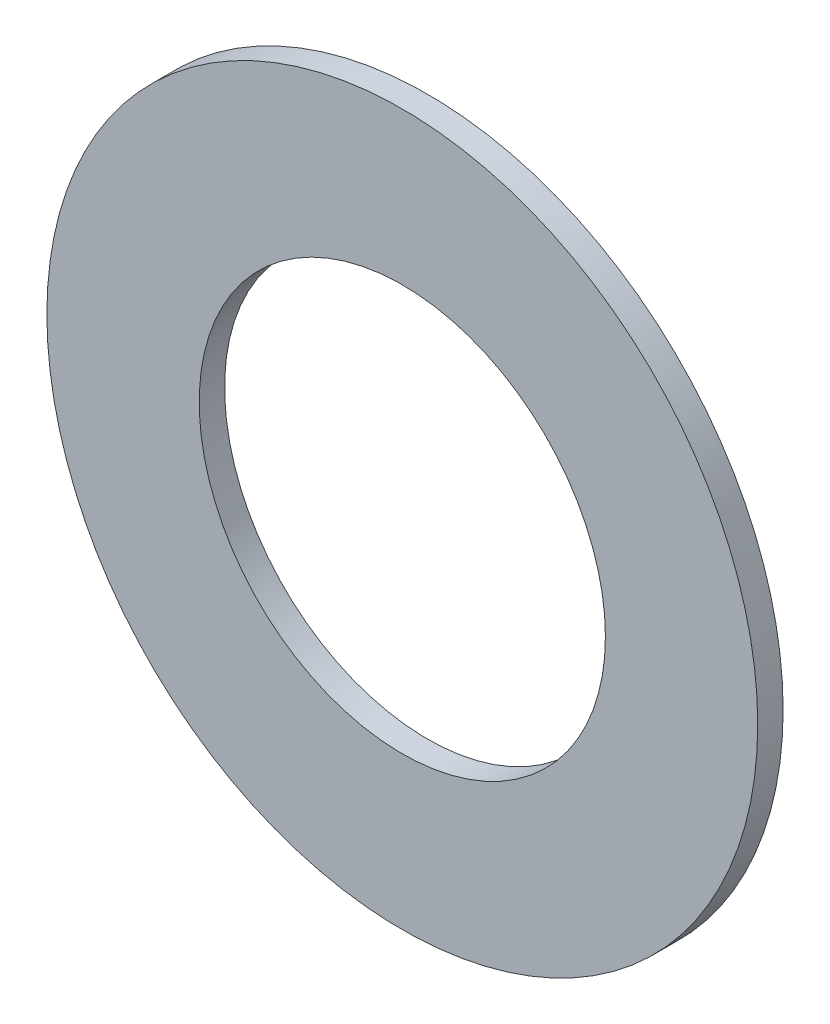
ISO-10303-21;
HEADER;
FILE_DESCRIPTION(('STEP AP214'),'2;1');
FILE_NAME('part.step','',(''),(''),'','','');
FILE_SCHEMA(('AUTOMOTIVE_DESIGN { 1 0 10303 214 1 1 1 1 }'));
ENDSEC;
DATA;
#1=APPLICATION_CONTEXT('core data for automotive mechanical design processes');
#2=APPLICATION_PROTOCOL_DEFINITION('international standard','automotive_design',2000,#1);
#3=PRODUCT_CONTEXT('',#1,'mechanical');
#4=PRODUCT('Part','Part','',(#3));
#5=PRODUCT_RELATED_PRODUCT_CATEGORY('part','',(#4));
#6=PRODUCT_DEFINITION_FORMATION('','',#4);
#7=PRODUCT_DEFINITION_CONTEXT('part definition',#1,'design');
#8=PRODUCT_DEFINITION('design','',#6,#7);
#9=PRODUCT_DEFINITION_SHAPE('','',#8);
#10=(LENGTH_UNIT() NAMED_UNIT(*) SI_UNIT(.MILLI.,.METRE.));
#11=(NAMED_UNIT(*) PLANE_ANGLE_UNIT() SI_UNIT($,.RADIAN.));
#12=(NAMED_UNIT(*) SI_UNIT($,.STERADIAN.) SOLID_ANGLE_UNIT());
#13=UNCERTAINTY_MEASURE_WITH_UNIT(LENGTH_MEASURE(1.E-05),#10,'distance_accuracy_value','');
#14=(GEOMETRIC_REPRESENTATION_CONTEXT(3) GLOBAL_UNCERTAINTY_ASSIGNED_CONTEXT((#13)) GLOBAL_UNIT_ASSIGNED_CONTEXT((#10,
#11,#12)) REPRESENTATION_CONTEXT('',''));
#15=CARTESIAN_POINT('',(0.,0.,0.));
#16=DIRECTION('',(0.,0.,1.));
#17=DIRECTION('',(1.,0.,0.));
#18=AXIS2_PLACEMENT_3D('',#15,#16,#17);
#19=CARTESIAN_POINT('',(0.,0.,1.));
#20=DIRECTION('',(0.,0.,-1.));
#21=DIRECTION('',(-1.,0.,0.));
#22=AXIS2_PLACEMENT_3D('',#19,#20,#21);
#23=CYLINDRICAL_SURFACE('',#22,14.);
#24=CARTESIAN_POINT('',(0.,0.,1.));
#25=DIRECTION('',(0.,0.,1.));
#26=DIRECTION('',(1.,0.,0.));
#27=AXIS2_PLACEMENT_3D('',#24,#25,#26);
#28=CIRCLE('',#27,14.);
#29=CARTESIAN_POINT('',(14.,0.,1.));
#30=VERTEX_POINT('',#29);
#31=EDGE_CURVE('E10',#30,#30,#28,.T.);
#32=ORIENTED_EDGE('',*,*,#31,.F.);
#33=EDGE_LOOP('',(#32));
#34=FACE_BOUND('',#33,.T.);
#35=CARTESIAN_POINT('',(0.,0.,0.));
#36=DIRECTION('',(0.,0.,1.));
#37=DIRECTION('',(1.,0.,0.));
#38=AXIS2_PLACEMENT_3D('',#35,#36,#37);
#39=CIRCLE('',#38,14.);
#40=CARTESIAN_POINT('',(14.,0.,0.));
#41=VERTEX_POINT('',#40);
#42=EDGE_CURVE('E40',#41,#41,#39,.T.);
#43=ORIENTED_EDGE('',*,*,#42,.T.);
#44=EDGE_LOOP('',(#43));
#45=FACE_BOUND('',#44,.T.);
#46=ADVANCED_FACE('F37',(#34,#45),#23,.T.);
#47=CARTESIAN_POINT('',(0.,0.,1.));
#48=DIRECTION('',(0.,0.,1.));
#49=DIRECTION('',(1.,0.,0.));
#50=AXIS2_PLACEMENT_3D('',#47,#48,#49);
#51=PLANE('',#50);
#52=CARTESIAN_POINT('',(0.,0.,1.));
#53=DIRECTION('',(0.,0.,1.));
#54=DIRECTION('',(1.,0.,0.));
#55=AXIS2_PLACEMENT_3D('',#52,#53,#54);
#56=CIRCLE('',#55,8.);
#57=CARTESIAN_POINT('',(8.,0.,1.));
#58=VERTEX_POINT('',#57);
#59=EDGE_CURVE('E51',#58,#58,#56,.T.);
#60=ORIENTED_EDGE('',*,*,#59,.F.);
#61=EDGE_LOOP('',(#60));
#62=FACE_BOUND('',#61,.T.);
#63=ORIENTED_EDGE('',*,*,#31,.T.);
#64=EDGE_LOOP('',(#63));
#65=FACE_BOUND('',#64,.T.);
#66=ADVANCED_FACE('F68',(#62,#65),#51,.T.);
#67=CARTESIAN_POINT('',(0.,0.,0.));
#68=DIRECTION('',(0.,0.,1.));
#69=DIRECTION('',(1.,0.,0.));
#70=AXIS2_PLACEMENT_3D('',#67,#68,#69);
#71=PLANE('',#70);
#72=CARTESIAN_POINT('',(0.,0.,0.));
#73=DIRECTION('',(0.,0.,1.));
#74=DIRECTION('',(1.,0.,0.));
#75=AXIS2_PLACEMENT_3D('',#72,#73,#74);
#76=CIRCLE('',#75,8.);
#77=CARTESIAN_POINT('',(8.,0.,0.));
#78=VERTEX_POINT('',#77);
#79=EDGE_CURVE('E49',#78,#78,#76,.T.);
#80=ORIENTED_EDGE('',*,*,#79,.T.);
#81=EDGE_LOOP('',(#80));
#82=FACE_BOUND('',#81,.T.);
#83=ORIENTED_EDGE('',*,*,#42,.F.);
#84=EDGE_LOOP('',(#83));
#85=FACE_BOUND('',#84,.T.);
#86=ADVANCED_FACE('F59',(#82,#85),#71,.F.);
#87=CARTESIAN_POINT('',(0.,0.,0.));
#88=DIRECTION('',(0.,0.,1.));
#89=DIRECTION('',(1.,0.,0.));
#90=AXIS2_PLACEMENT_3D('',#87,#88,#89);
#91=CYLINDRICAL_SURFACE('',#90,8.);
#92=ORIENTED_EDGE('',*,*,#79,.F.);
#93=EDGE_LOOP('',(#92));
#94=FACE_BOUND('',#93,.T.);
#95=ORIENTED_EDGE('',*,*,#59,.T.);
#96=EDGE_LOOP('',(#95));
#97=FACE_BOUND('',#96,.T.);
#98=ADVANCED_FACE('F62',(#94,#97),#91,.F.);
#99=CLOSED_SHELL('',(#46,#66,#86,#98));
#100=MANIFOLD_SOLID_BREP('B2',#99);
#101=ADVANCED_BREP_SHAPE_REPRESENTATION('',(#18,#100),#14);
#102=SHAPE_DEFINITION_REPRESENTATION(#9,#101);
ENDSEC;
END-ISO-10303-21;
